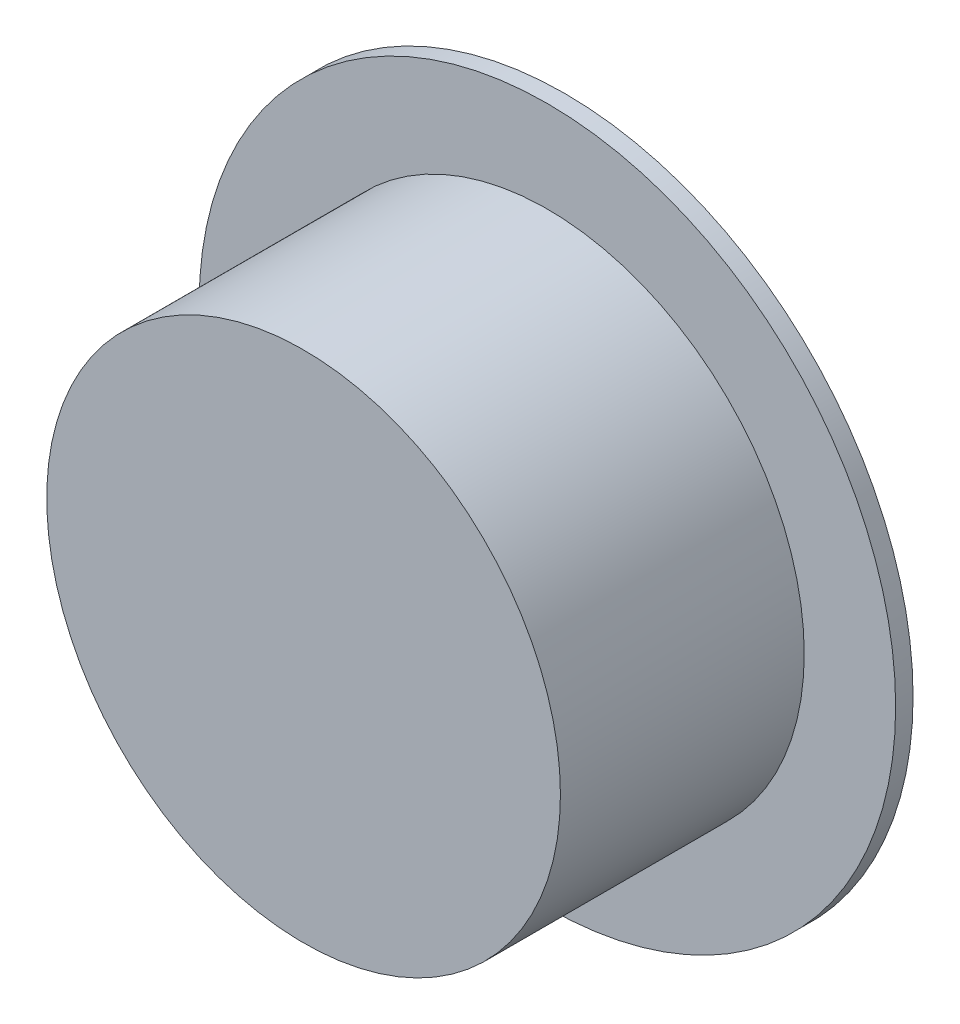
ISO-10303-21;
HEADER;
FILE_DESCRIPTION(('STEP AP214'),'2;1');
FILE_NAME('part.step','',(''),(''),'','','');
FILE_SCHEMA(('AUTOMOTIVE_DESIGN { 1 0 10303 214 1 1 1 1 }'));
ENDSEC;
DATA;
#1=APPLICATION_CONTEXT('core data for automotive mechanical design processes');
#2=APPLICATION_PROTOCOL_DEFINITION('international standard','automotive_design',2000,#1);
#3=PRODUCT_CONTEXT('',#1,'mechanical');
#4=PRODUCT('Part','Part','',(#3));
#5=PRODUCT_RELATED_PRODUCT_CATEGORY('part','',(#4));
#6=PRODUCT_DEFINITION_FORMATION('','',#4);
#7=PRODUCT_DEFINITION_CONTEXT('part definition',#1,'design');
#8=PRODUCT_DEFINITION('design','',#6,#7);
#9=PRODUCT_DEFINITION_SHAPE('','',#8);
#10=(LENGTH_UNIT() NAMED_UNIT(*) SI_UNIT(.MILLI.,.METRE.));
#11=(NAMED_UNIT(*) PLANE_ANGLE_UNIT() SI_UNIT($,.RADIAN.));
#12=(NAMED_UNIT(*) SI_UNIT($,.STERADIAN.) SOLID_ANGLE_UNIT());
#13=UNCERTAINTY_MEASURE_WITH_UNIT(LENGTH_MEASURE(1.E-05),#10,'distance_accuracy_value','');
#14=(GEOMETRIC_REPRESENTATION_CONTEXT(3) GLOBAL_UNCERTAINTY_ASSIGNED_CONTEXT((#13)) GLOBAL_UNIT_ASSIGNED_CONTEXT((#10,
#11,#12)) REPRESENTATION_CONTEXT('',''));
#15=CARTESIAN_POINT('',(0.,0.,0.));
#16=DIRECTION('',(0.,0.,1.));
#17=DIRECTION('',(1.,0.,0.));
#18=AXIS2_PLACEMENT_3D('',#15,#16,#17);
#19=CARTESIAN_POINT('',(0.,0.,7.5));
#20=DIRECTION('',(0.,0.,-1.));
#21=DIRECTION('',(-1.,0.,0.));
#22=AXIS2_PLACEMENT_3D('',#19,#20,#21);
#23=CYLINDRICAL_SURFACE('',#22,14.75);
#24=CARTESIAN_POINT('',(0.,0.,-6.5));
#25=DIRECTION('',(0.,0.,1.));
#26=DIRECTION('',(1.,0.,0.));
#27=AXIS2_PLACEMENT_3D('',#24,#25,#26);
#28=CIRCLE('',#27,14.75);
#29=CARTESIAN_POINT('',(14.75,0.,-6.5));
#30=VERTEX_POINT('',#29);
#31=EDGE_CURVE('E47',#30,#30,#28,.T.);
#32=ORIENTED_EDGE('',*,*,#31,.T.);
#33=EDGE_LOOP('',(#32));
#34=FACE_BOUND('',#33,.T.);
#35=CARTESIAN_POINT('',(0.,0.,7.5));
#36=DIRECTION('',(0.,0.,1.));
#37=DIRECTION('',(1.,0.,0.));
#38=AXIS2_PLACEMENT_3D('',#35,#36,#37);
#39=CIRCLE('',#38,14.75);
#40=CARTESIAN_POINT('',(14.75,0.,7.5));
#41=VERTEX_POINT('',#40);
#42=EDGE_CURVE('E12',#41,#41,#39,.T.);
#43=ORIENTED_EDGE('',*,*,#42,.F.);
#44=EDGE_LOOP('',(#43));
#45=FACE_BOUND('',#44,.T.);
#46=ADVANCED_FACE('F44',(#34,#45),#23,.T.);
#47=CARTESIAN_POINT('',(0.,0.,7.5));
#48=DIRECTION('',(0.,0.,1.));
#49=DIRECTION('',(1.,0.,0.));
#50=AXIS2_PLACEMENT_3D('',#47,#48,#49);
#51=PLANE('',#50);
#52=ORIENTED_EDGE('',*,*,#42,.T.);
#53=EDGE_LOOP('',(#52));
#54=FACE_BOUND('',#53,.T.);
#55=ADVANCED_FACE('F84',(#54),#51,.T.);
#56=CARTESIAN_POINT('',(0.,0.,-6.5));
#57=DIRECTION('',(0.,0.,-1.));
#58=DIRECTION('',(-1.,0.,0.));
#59=AXIS2_PLACEMENT_3D('',#56,#57,#58);
#60=CYLINDRICAL_SURFACE('',#59,20.);
#61=CARTESIAN_POINT('',(0.,0.,-6.5));
#62=DIRECTION('',(0.,0.,1.));
#63=DIRECTION('',(1.,0.,0.));
#64=AXIS2_PLACEMENT_3D('',#61,#62,#63);
#65=CIRCLE('',#64,20.);
#66=CARTESIAN_POINT('',(20.,0.,-6.5));
#67=VERTEX_POINT('',#66);
#68=EDGE_CURVE('E54',#67,#67,#65,.T.);
#69=ORIENTED_EDGE('',*,*,#68,.F.);
#70=EDGE_LOOP('',(#69));
#71=FACE_BOUND('',#70,.T.);
#72=CARTESIAN_POINT('',(0.,0.,-7.5));
#73=DIRECTION('',(0.,0.,1.));
#74=DIRECTION('',(1.,0.,0.));
#75=AXIS2_PLACEMENT_3D('',#72,#73,#74);
#76=CIRCLE('',#75,20.);
#77=CARTESIAN_POINT('',(20.,0.,-7.5));
#78=VERTEX_POINT('',#77);
#79=EDGE_CURVE('E56',#78,#78,#76,.T.);
#80=ORIENTED_EDGE('',*,*,#79,.T.);
#81=EDGE_LOOP('',(#80));
#82=FACE_BOUND('',#81,.T.);
#83=ADVANCED_FACE('F82',(#71,#82),#60,.T.);
#84=CARTESIAN_POINT('',(0.,0.,-6.5));
#85=DIRECTION('',(0.,0.,1.));
#86=DIRECTION('',(1.,0.,0.));
#87=AXIS2_PLACEMENT_3D('',#84,#85,#86);
#88=PLANE('',#87);
#89=ORIENTED_EDGE('',*,*,#31,.F.);
#90=EDGE_LOOP('',(#89));
#91=FACE_BOUND('',#90,.T.);
#92=ORIENTED_EDGE('',*,*,#68,.T.);
#93=EDGE_LOOP('',(#92));
#94=FACE_BOUND('',#93,.T.);
#95=ADVANCED_FACE('F79',(#91,#94),#88,.T.);
#96=CARTESIAN_POINT('',(0.,0.,-7.5));
#97=DIRECTION('',(0.,0.,1.));
#98=DIRECTION('',(1.,0.,0.));
#99=AXIS2_PLACEMENT_3D('',#96,#97,#98);
#100=PLANE('',#99);
#101=CARTESIAN_POINT('',(0.,0.,-7.5));
#102=DIRECTION('',(0.,0.,-1.));
#103=DIRECTION('',(-1.,0.,0.));
#104=AXIS2_PLACEMENT_3D('',#101,#102,#103);
#105=CIRCLE('',#104,12.5);
#106=CARTESIAN_POINT('',(-12.5,0.,-7.5));
#107=VERTEX_POINT('',#106);
#108=EDGE_CURVE('E62',#107,#107,#105,.T.);
#109=ORIENTED_EDGE('',*,*,#108,.F.);
#110=EDGE_LOOP('',(#109));
#111=FACE_BOUND('',#110,.T.);
#112=ORIENTED_EDGE('',*,*,#79,.F.);
#113=EDGE_LOOP('',(#112));
#114=FACE_BOUND('',#113,.T.);
#115=ADVANCED_FACE('F73',(#111,#114),#100,.F.);
#116=CARTESIAN_POINT('',(0.,0.,2.5));
#117=DIRECTION('',(0.,0.,-1.));
#118=DIRECTION('',(-1.,0.,0.));
#119=AXIS2_PLACEMENT_3D('',#116,#117,#118);
#120=CYLINDRICAL_SURFACE('',#119,12.5);
#121=CARTESIAN_POINT('',(0.,0.,2.5));
#122=DIRECTION('',(0.,0.,-1.));
#123=DIRECTION('',(-1.,0.,0.));
#124=AXIS2_PLACEMENT_3D('',#121,#122,#123);
#125=CIRCLE('',#124,12.5);
#126=CARTESIAN_POINT('',(-12.5,0.,2.5));
#127=VERTEX_POINT('',#126);
#128=EDGE_CURVE('E59',#127,#127,#125,.T.);
#129=ORIENTED_EDGE('',*,*,#128,.F.);
#130=EDGE_LOOP('',(#129));
#131=FACE_BOUND('',#130,.T.);
#132=ORIENTED_EDGE('',*,*,#108,.T.);
#133=EDGE_LOOP('',(#132));
#134=FACE_BOUND('',#133,.T.);
#135=ADVANCED_FACE('F70',(#131,#134),#120,.F.);
#136=CARTESIAN_POINT('',(0.,0.,2.5));
#137=DIRECTION('',(0.,0.,-1.));
#138=DIRECTION('',(-1.,0.,0.));
#139=AXIS2_PLACEMENT_3D('',#136,#137,#138);
#140=PLANE('',#139);
#141=ORIENTED_EDGE('',*,*,#128,.T.);
#142=EDGE_LOOP('',(#141));
#143=FACE_BOUND('',#142,.T.);
#144=ADVANCED_FACE('F68',(#143),#140,.T.);
#145=CLOSED_SHELL('',(#46,#55,#83,#95,#115,#135,#144));
#146=MANIFOLD_SOLID_BREP('B2',#145);
#147=ADVANCED_BREP_SHAPE_REPRESENTATION('',(#18,#146),#14);
#148=SHAPE_DEFINITION_REPRESENTATION(#9,#147);
ENDSEC;
END-ISO-10303-21;
